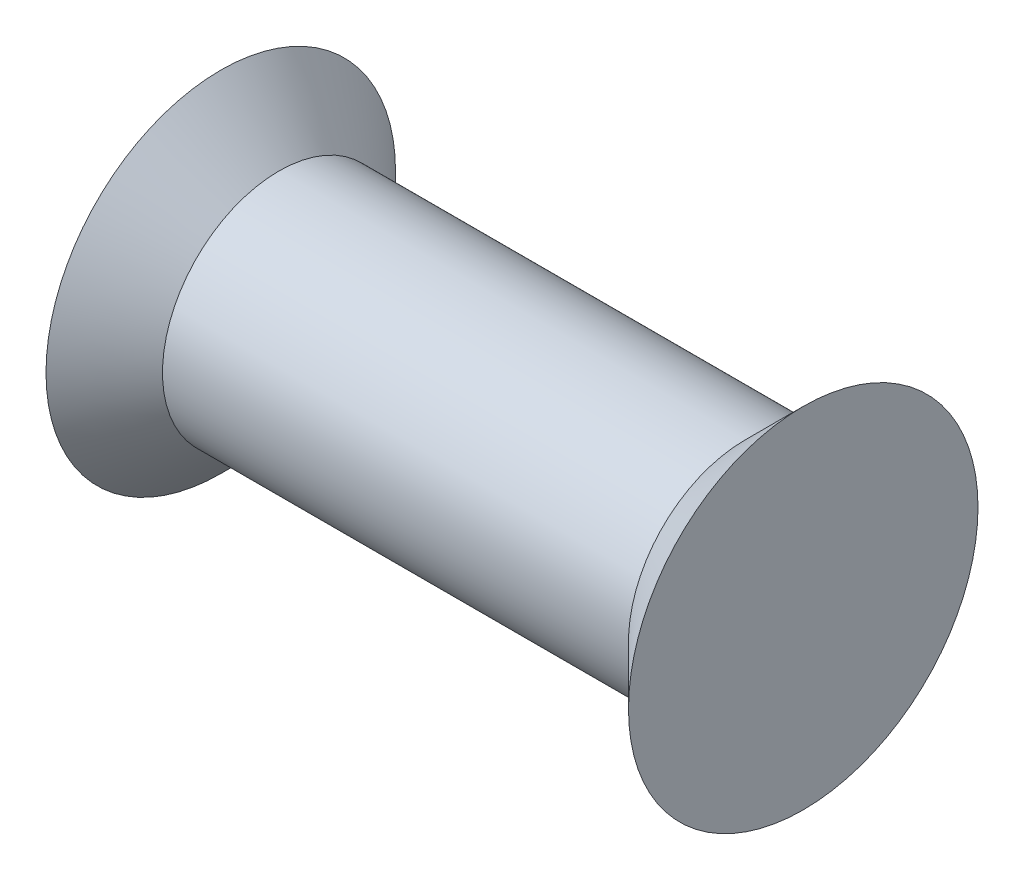
ISO-10303-21;
HEADER;
FILE_DESCRIPTION(('STEP AP214'),'2;1');
FILE_NAME('part.step','',(''),(''),'','','');
FILE_SCHEMA(('AUTOMOTIVE_DESIGN { 1 0 10303 214 1 1 1 1 }'));
ENDSEC;
DATA;
#1=APPLICATION_CONTEXT('core data for automotive mechanical design processes');
#2=APPLICATION_PROTOCOL_DEFINITION('international standard','automotive_design',2000,#1);
#3=PRODUCT_CONTEXT('',#1,'mechanical');
#4=PRODUCT('Part','Part','',(#3));
#5=PRODUCT_RELATED_PRODUCT_CATEGORY('part','',(#4));
#6=PRODUCT_DEFINITION_FORMATION('','',#4);
#7=PRODUCT_DEFINITION_CONTEXT('part definition',#1,'design');
#8=PRODUCT_DEFINITION('design','',#6,#7);
#9=PRODUCT_DEFINITION_SHAPE('','',#8);
#10=(LENGTH_UNIT() NAMED_UNIT(*) SI_UNIT(.MILLI.,.METRE.));
#11=(NAMED_UNIT(*) PLANE_ANGLE_UNIT() SI_UNIT($,.RADIAN.));
#12=(NAMED_UNIT(*) SI_UNIT($,.STERADIAN.) SOLID_ANGLE_UNIT());
#13=UNCERTAINTY_MEASURE_WITH_UNIT(LENGTH_MEASURE(1.E-05),#10,'distance_accuracy_value','');
#14=(GEOMETRIC_REPRESENTATION_CONTEXT(3) GLOBAL_UNCERTAINTY_ASSIGNED_CONTEXT((#13)) GLOBAL_UNIT_ASSIGNED_CONTEXT((#10,
#11,#12)) REPRESENTATION_CONTEXT('',''));
#15=CARTESIAN_POINT('',(0.,0.,0.));
#16=DIRECTION('',(0.,0.,1.));
#17=DIRECTION('',(1.,0.,0.));
#18=AXIS2_PLACEMENT_3D('',#15,#16,#17);
#19=CARTESIAN_POINT('',(2.5,0.,0.));
#20=DIRECTION('',(1.,0.,0.));
#21=DIRECTION('',(0.,1.,0.));
#22=AXIS2_PLACEMENT_3D('',#19,#20,#21);
#23=PLANE('',#22);
#24=CARTESIAN_POINT('',(2.5,0.,0.));
#25=DIRECTION('',(-1.,0.,0.));
#26=DIRECTION('',(0.,-1.,0.));
#27=AXIS2_PLACEMENT_3D('',#24,#25,#26);
#28=CIRCLE('',#27,1.50000000000001);
#29=CARTESIAN_POINT('',(2.5,-1.50000000000001,0.));
#30=VERTEX_POINT('',#29);
#31=EDGE_CURVE('E10',#30,#30,#28,.T.);
#32=ORIENTED_EDGE('',*,*,#31,.F.);
#33=EDGE_LOOP('',(#32));
#34=FACE_BOUND('',#33,.T.);
#35=ADVANCED_FACE('F41',(#34),#23,.T.);
#36=CARTESIAN_POINT('',(2.,0.,0.));
#37=DIRECTION('',(1.,0.,0.));
#38=DIRECTION('',(0.,1.,0.));
#39=AXIS2_PLACEMENT_3D('',#36,#37,#38);
#40=CONICAL_SURFACE('',#39,1.,0.785398163397454);
#41=ORIENTED_EDGE('',*,*,#31,.T.);
#42=EDGE_LOOP('',(#41));
#43=FACE_BOUND('',#42,.T.);
#44=CARTESIAN_POINT('',(2.,0.,0.));
#45=DIRECTION('',(-1.,0.,0.));
#46=DIRECTION('',(0.,-1.,0.));
#47=AXIS2_PLACEMENT_3D('',#44,#45,#46);
#48=CIRCLE('',#47,1.);
#49=CARTESIAN_POINT('',(2.,-1.,0.));
#50=VERTEX_POINT('',#49);
#51=EDGE_CURVE('E48',#50,#50,#48,.T.);
#52=ORIENTED_EDGE('',*,*,#51,.F.);
#53=EDGE_LOOP('',(#52));
#54=FACE_BOUND('',#53,.T.);
#55=ADVANCED_FACE('F70',(#43,#54),#40,.T.);
#56=CARTESIAN_POINT('',(0.,0.,0.));
#57=DIRECTION('',(-1.,0.,0.));
#58=DIRECTION('',(0.,-1.,0.));
#59=AXIS2_PLACEMENT_3D('',#56,#57,#58);
#60=CYLINDRICAL_SURFACE('',#59,1.);
#61=ORIENTED_EDGE('',*,*,#51,.T.);
#62=EDGE_LOOP('',(#61));
#63=FACE_BOUND('',#62,.T.);
#64=CARTESIAN_POINT('',(-2.,0.,0.));
#65=DIRECTION('',(-1.,0.,0.));
#66=DIRECTION('',(0.,-1.,0.));
#67=AXIS2_PLACEMENT_3D('',#64,#65,#66);
#68=CIRCLE('',#67,1.);
#69=CARTESIAN_POINT('',(-2.,-1.,0.));
#70=VERTEX_POINT('',#69);
#71=EDGE_CURVE('E58',#70,#70,#68,.T.);
#72=ORIENTED_EDGE('',*,*,#71,.F.);
#73=EDGE_LOOP('',(#72));
#74=FACE_BOUND('',#73,.T.);
#75=ADVANCED_FACE('F67',(#63,#74),#60,.T.);
#76=CARTESIAN_POINT('',(-2.5,0.,0.));
#77=DIRECTION('',(-1.,0.,0.));
#78=DIRECTION('',(0.,1.,0.));
#79=AXIS2_PLACEMENT_3D('',#76,#77,#78);
#80=PLANE('',#79);
#81=CARTESIAN_POINT('',(-2.5,0.,0.));
#82=DIRECTION('',(-1.,0.,0.));
#83=DIRECTION('',(0.,-1.,0.));
#84=AXIS2_PLACEMENT_3D('',#81,#82,#83);
#85=CIRCLE('',#84,1.50000000000001);
#86=CARTESIAN_POINT('',(-2.5,-1.50000000000001,0.));
#87=VERTEX_POINT('',#86);
#88=EDGE_CURVE('E53',#87,#87,#85,.T.);
#89=ORIENTED_EDGE('',*,*,#88,.T.);
#90=EDGE_LOOP('',(#89));
#91=FACE_BOUND('',#90,.T.);
#92=ADVANCED_FACE('F69',(#91),#80,.T.);
#93=CARTESIAN_POINT('',(-2.,0.,0.));
#94=DIRECTION('',(-1.,0.,0.));
#95=DIRECTION('',(0.,1.,0.));
#96=AXIS2_PLACEMENT_3D('',#93,#94,#95);
#97=CONICAL_SURFACE('',#96,1.,0.785398163397454);
#98=ORIENTED_EDGE('',*,*,#88,.F.);
#99=EDGE_LOOP('',(#98));
#100=FACE_BOUND('',#99,.T.);
#101=ORIENTED_EDGE('',*,*,#71,.T.);
#102=EDGE_LOOP('',(#101));
#103=FACE_BOUND('',#102,.T.);
#104=ADVANCED_FACE('F65',(#100,#103),#97,.T.);
#105=CLOSED_SHELL('',(#35,#55,#75,#92,#104));
#106=MANIFOLD_SOLID_BREP('B2',#105);
#107=ADVANCED_BREP_SHAPE_REPRESENTATION('',(#18,#106),#14);
#108=SHAPE_DEFINITION_REPRESENTATION(#9,#107);
ENDSEC;
END-ISO-10303-21;
